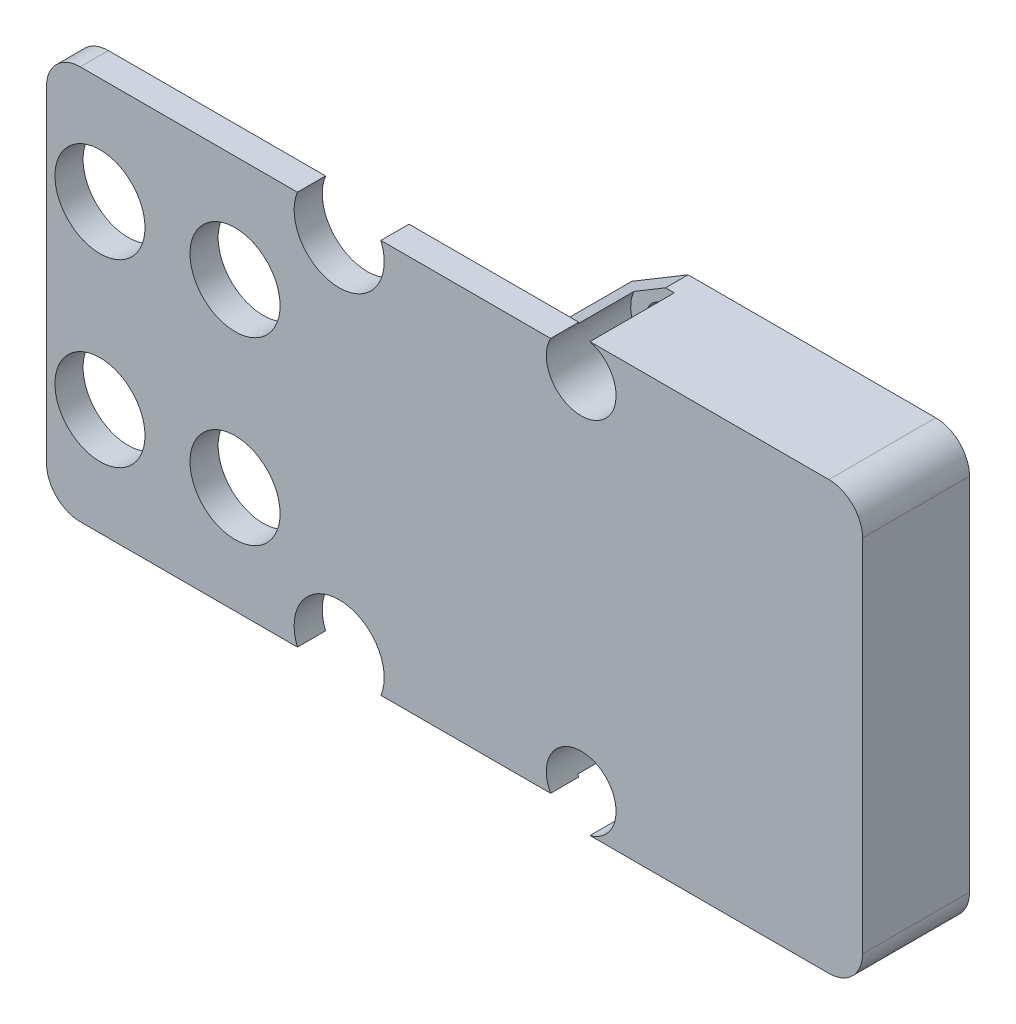
ISO-10303-21;
HEADER;
FILE_DESCRIPTION(('STEP AP214'),'2;1');
FILE_NAME('part.step','',(''),(''),'','','');
FILE_SCHEMA(('AUTOMOTIVE_DESIGN { 1 0 10303 214 1 1 1 1 }'));
ENDSEC;
DATA;
#1=APPLICATION_CONTEXT('core data for automotive mechanical design processes');
#2=APPLICATION_PROTOCOL_DEFINITION('international standard','automotive_design',2000,#1);
#3=PRODUCT_CONTEXT('',#1,'mechanical');
#4=PRODUCT('Part','Part','',(#3));
#5=PRODUCT_RELATED_PRODUCT_CATEGORY('part','',(#4));
#6=PRODUCT_DEFINITION_FORMATION('','',#4);
#7=PRODUCT_DEFINITION_CONTEXT('part definition',#1,'design');
#8=PRODUCT_DEFINITION('design','',#6,#7);
#9=PRODUCT_DEFINITION_SHAPE('','',#8);
#10=(LENGTH_UNIT() NAMED_UNIT(*) SI_UNIT(.MILLI.,.METRE.));
#11=(NAMED_UNIT(*) PLANE_ANGLE_UNIT() SI_UNIT($,.RADIAN.));
#12=(NAMED_UNIT(*) SI_UNIT($,.STERADIAN.) SOLID_ANGLE_UNIT());
#13=UNCERTAINTY_MEASURE_WITH_UNIT(LENGTH_MEASURE(1.E-05),#10,'distance_accuracy_value','');
#14=(GEOMETRIC_REPRESENTATION_CONTEXT(3) GLOBAL_UNCERTAINTY_ASSIGNED_CONTEXT((#13)) GLOBAL_UNIT_ASSIGNED_CONTEXT((#10,
#11,#12)) REPRESENTATION_CONTEXT('',''));
#15=CARTESIAN_POINT('',(0.,0.,0.));
#16=DIRECTION('',(0.,0.,1.));
#17=DIRECTION('',(1.,0.,0.));
#18=AXIS2_PLACEMENT_3D('',#15,#16,#17);
#19=CARTESIAN_POINT('',(-69.5864793964444,27.6995976152245,9.5));
#20=DIRECTION('',(0.,0.,-1.));
#21=DIRECTION('',(-1.,0.,0.));
#22=AXIS2_PLACEMENT_3D('',#19,#20,#21);
#23=CYLINDRICAL_SURFACE('',#22,1.70737013163461);
#24=CARTESIAN_POINT('',(-69.5864793964444,27.6995976152245,0.));
#25=DIRECTION('',(0.,0.,1.));
#26=DIRECTION('',(1.,0.,0.));
#27=AXIS2_PLACEMENT_3D('',#24,#25,#26);
#28=CIRCLE('',#27,1.70737013163461);
#29=CARTESIAN_POINT('',(-67.8791092648098,27.6995976152245,0.));
#30=VERTEX_POINT('',#29);
#31=EDGE_CURVE('E284',#30,#30,#28,.T.);
#32=ORIENTED_EDGE('',*,*,#31,.F.);
#33=EDGE_LOOP('',(#32));
#34=FACE_BOUND('',#33,.T.);
#35=CARTESIAN_POINT('',(-69.5864793964444,27.6995976152245,2.));
#36=DIRECTION('',(0.,0.,1.));
#37=DIRECTION('',(1.,0.,0.));
#38=AXIS2_PLACEMENT_3D('',#35,#36,#37);
#39=CIRCLE('',#38,1.70737013163461);
#40=CARTESIAN_POINT('',(-67.8791092648098,27.6995976152245,2.));
#41=VERTEX_POINT('',#40);
#42=EDGE_CURVE('E37',#41,#41,#39,.T.);
#43=ORIENTED_EDGE('',*,*,#42,.T.);
#44=EDGE_LOOP('',(#43));
#45=FACE_BOUND('',#44,.T.);
#46=ADVANCED_FACE('F33',(#34,#45),#23,.F.);
#47=CARTESIAN_POINT('',(-69.5864793964444,-4.30040238477549,9.5));
#48=DIRECTION('',(0.,0.,-1.));
#49=DIRECTION('',(-1.,0.,0.));
#50=AXIS2_PLACEMENT_3D('',#47,#48,#49);
#51=CYLINDRICAL_SURFACE('',#50,1.70737013163461);
#52=CARTESIAN_POINT('',(-69.5864793964444,-4.30040238477549,0.));
#53=DIRECTION('',(0.,0.,1.));
#54=DIRECTION('',(1.,0.,0.));
#55=AXIS2_PLACEMENT_3D('',#52,#53,#54);
#56=CIRCLE('',#55,1.70737013163461);
#57=CARTESIAN_POINT('',(-67.8791092648098,-4.30040238477549,0.));
#58=VERTEX_POINT('',#57);
#59=EDGE_CURVE('E274',#58,#58,#56,.T.);
#60=ORIENTED_EDGE('',*,*,#59,.F.);
#61=EDGE_LOOP('',(#60));
#62=FACE_BOUND('',#61,.T.);
#63=CARTESIAN_POINT('',(-69.5864793964444,-4.30040238477549,2.));
#64=DIRECTION('',(0.,0.,1.));
#65=DIRECTION('',(1.,0.,0.));
#66=AXIS2_PLACEMENT_3D('',#63,#64,#65);
#67=CIRCLE('',#66,1.70737013163461);
#68=CARTESIAN_POINT('',(-67.8791092648098,-4.30040238477549,2.));
#69=VERTEX_POINT('',#68);
#70=EDGE_CURVE('E208',#69,#69,#67,.T.);
#71=ORIENTED_EDGE('',*,*,#70,.T.);
#72=EDGE_LOOP('',(#71));
#73=FACE_BOUND('',#72,.T.);
#74=ADVANCED_FACE('F458',(#62,#73),#51,.F.);
#75=CARTESIAN_POINT('',(-117.086479396444,-5.80040238477549,7.));
#76=DIRECTION('',(0.,-1.,0.));
#77=DIRECTION('',(1.,0.,0.));
#78=AXIS2_PLACEMENT_3D('',#75,#76,#77);
#79=PLANE('',#78);
#80=DIRECTION('',(0.,0.,1.));
#81=VECTOR('',#80,1.);
#82=CARTESIAN_POINT('',(-72.2994113896945,-5.80040238477549,2.));
#83=LINE('',#82,#81);
#84=CARTESIAN_POINT('',(-72.2994113896945,-5.80040238477549,9.5));
#85=VERTEX_POINT('',#84);
#86=CARTESIAN_POINT('',(-72.2994113896945,-5.80040238477549,7.));
#87=VERTEX_POINT('',#86);
#88=EDGE_CURVE('E50',#85,#87,#83,.F.);
#89=ORIENTED_EDGE('',*,*,#88,.F.);
#90=DIRECTION('',(1.,0.,0.));
#91=VECTOR('',#90,1.);
#92=CARTESIAN_POINT('',(-117.086479396444,-5.80040238477549,9.5));
#93=LINE('',#92,#91);
#94=CARTESIAN_POINT('',(-87.3783801528965,-5.80040238477549,9.5));
#95=VERTEX_POINT('',#94);
#96=EDGE_CURVE('E280',#95,#85,#93,.T.);
#97=ORIENTED_EDGE('',*,*,#96,.F.);
#98=DIRECTION('',(0.,0.,1.));
#99=VECTOR('',#98,1.);
#100=CARTESIAN_POINT('',(-87.3783801528965,-5.80040238477549,7.));
#101=LINE('',#100,#99);
#102=CARTESIAN_POINT('',(-87.3783801528965,-5.80040238477549,7.));
#103=VERTEX_POINT('',#102);
#104=EDGE_CURVE('E248',#103,#95,#101,.T.);
#105=ORIENTED_EDGE('',*,*,#104,.F.);
#106=DIRECTION('',(1.,0.,0.));
#107=VECTOR('',#106,1.);
#108=CARTESIAN_POINT('',(-117.086479396444,-5.80040238477549,7.));
#109=LINE('',#108,#107);
#110=EDGE_CURVE('E266',#103,#87,#109,.T.);
#111=ORIENTED_EDGE('',*,*,#110,.T.);
#112=EDGE_LOOP('',(#89,#97,#105,#111));
#113=FACE_BOUND('',#112,.T.);
#114=ADVANCED_FACE('F404',(#113),#79,.T.);
#115=CARTESIAN_POINT('',(-72.0864793964444,29.1995976152245,7.));
#116=DIRECTION('',(0.,1.,0.));
#117=DIRECTION('',(-1.,0.,0.));
#118=AXIS2_PLACEMENT_3D('',#115,#116,#117);
#119=PLANE('',#118);
#120=DIRECTION('',(-1.,0.,0.));
#121=VECTOR('',#120,1.);
#122=CARTESIAN_POINT('',(-72.0864793964444,29.1995976152245,7.));
#123=LINE('',#122,#121);
#124=CARTESIAN_POINT('',(-94.7945786399922,29.1995976152245,7.));
#125=VERTEX_POINT('',#124);
#126=CARTESIAN_POINT('',(-114.086479396444,29.1995976152245,7.));
#127=VERTEX_POINT('',#126);
#128=EDGE_CURVE('E259',#125,#127,#123,.T.);
#129=ORIENTED_EDGE('',*,*,#128,.T.);
#130=DIRECTION('',(0.,0.,1.));
#131=VECTOR('',#130,1.);
#132=CARTESIAN_POINT('',(-114.086479396444,29.1995976152245,7.));
#133=LINE('',#132,#131);
#134=CARTESIAN_POINT('',(-114.086479396444,29.1995976152245,9.5));
#135=VERTEX_POINT('',#134);
#136=EDGE_CURVE('E325',#127,#135,#133,.T.);
#137=ORIENTED_EDGE('',*,*,#136,.T.);
#138=DIRECTION('',(-1.,0.,0.));
#139=VECTOR('',#138,1.);
#140=CARTESIAN_POINT('',(-72.0864793964444,29.1995976152245,9.5));
#141=LINE('',#140,#139);
#142=CARTESIAN_POINT('',(-94.7945786399922,29.1995976152245,9.5));
#143=VERTEX_POINT('',#142);
#144=EDGE_CURVE('E255',#143,#135,#141,.T.);
#145=ORIENTED_EDGE('',*,*,#144,.F.);
#146=DIRECTION('',(0.,0.,1.));
#147=VECTOR('',#146,1.);
#148=CARTESIAN_POINT('',(-94.7945786399922,29.1995976152245,7.));
#149=LINE('',#148,#147);
#150=EDGE_CURVE('E253',#125,#143,#149,.T.);
#151=ORIENTED_EDGE('',*,*,#150,.F.);
#152=EDGE_LOOP('',(#129,#137,#145,#151));
#153=FACE_BOUND('',#152,.T.);
#154=ADVANCED_FACE('F436',(#153),#119,.T.);
#155=CARTESIAN_POINT('',(-74.5864793964444,27.6995976152245,9.5));
#156=DIRECTION('',(1.,0.,0.));
#157=DIRECTION('',(0.,0.,-1.));
#158=AXIS2_PLACEMENT_3D('',#155,#156,#157);
#159=PLANE('',#158);
#160=DIRECTION('',(0.,1.,0.));
#161=VECTOR('',#160,1.);
#162=CARTESIAN_POINT('',(-74.5864793964444,-4.30040238477549,7.));
#163=LINE('',#162,#161);
#164=CARTESIAN_POINT('',(-74.5864793964444,-4.30040238477549,7.));
#165=VERTEX_POINT('',#164);
#166=CARTESIAN_POINT('',(-74.5864793964444,27.6995976152245,7.));
#167=VERTEX_POINT('',#166);
#168=EDGE_CURVE('E271',#165,#167,#163,.T.);
#169=ORIENTED_EDGE('',*,*,#168,.T.);
#170=DIRECTION('',(0.,0.,-1.));
#171=VECTOR('',#170,1.);
#172=CARTESIAN_POINT('',(-74.5864793964444,27.6995976152245,9.5));
#173=LINE('',#172,#171);
#174=CARTESIAN_POINT('',(-74.5864793964444,27.6995976152245,0.));
#175=VERTEX_POINT('',#174);
#176=EDGE_CURVE('E317',#167,#175,#173,.T.);
#177=ORIENTED_EDGE('',*,*,#176,.T.);
#178=DIRECTION('',(0.,-1.,0.));
#179=VECTOR('',#178,1.);
#180=CARTESIAN_POINT('',(-74.5864793964444,27.6995976152245,0.));
#181=LINE('',#180,#179);
#182=CARTESIAN_POINT('',(-74.5864793964444,-4.30040238477549,0.));
#183=VERTEX_POINT('',#182);
#184=EDGE_CURVE('E300',#175,#183,#181,.T.);
#185=ORIENTED_EDGE('',*,*,#184,.T.);
#186=DIRECTION('',(0.,0.,-1.));
#187=VECTOR('',#186,1.);
#188=CARTESIAN_POINT('',(-74.5864793964444,-4.30040238477549,9.5));
#189=LINE('',#188,#187);
#190=EDGE_CURVE('E315',#165,#183,#189,.T.);
#191=ORIENTED_EDGE('',*,*,#190,.F.);
#192=EDGE_LOOP('',(#169,#177,#185,#191));
#193=FACE_BOUND('',#192,.T.);
#194=ADVANCED_FACE('F396',(#193),#159,.F.);
#195=CARTESIAN_POINT('',(0.,0.,9.5));
#196=DIRECTION('',(0.,0.,-1.));
#197=DIRECTION('',(-1.,0.,0.));
#198=AXIS2_PLACEMENT_3D('',#195,#196,#197);
#199=PLANE('',#198);
#200=CARTESIAN_POINT('',(-100.336479396444,19.6995976152245,9.5));
#201=DIRECTION('',(0.,0.,1.));
#202=DIRECTION('',(1.,0.,0.));
#203=AXIS2_PLACEMENT_3D('',#200,#201,#202);
#204=CIRCLE('',#203,4.00000000000001);
#205=CARTESIAN_POINT('',(-96.3364793964443,19.6995976152245,9.5));
#206=VERTEX_POINT('',#205);
#207=EDGE_CURVE('E219',#206,#206,#204,.T.);
#208=ORIENTED_EDGE('',*,*,#207,.F.);
#209=EDGE_LOOP('',(#208));
#210=FACE_BOUND('',#209,.T.);
#211=CARTESIAN_POINT('',(-112.336479396444,19.6995976152245,9.5));
#212=DIRECTION('',(0.,0.,1.));
#213=DIRECTION('',(1.,0.,0.));
#214=AXIS2_PLACEMENT_3D('',#211,#212,#213);
#215=CIRCLE('',#214,4.00000000000001);
#216=CARTESIAN_POINT('',(-108.336479396444,19.6995976152245,9.5));
#217=VERTEX_POINT('',#216);
#218=EDGE_CURVE('E220',#217,#217,#215,.T.);
#219=ORIENTED_EDGE('',*,*,#218,.F.);
#220=EDGE_LOOP('',(#219));
#221=FACE_BOUND('',#220,.T.);
#222=CARTESIAN_POINT('',(-112.336479396444,3.69959761522452,9.5));
#223=DIRECTION('',(0.,0.,1.));
#224=DIRECTION('',(1.,0.,0.));
#225=AXIS2_PLACEMENT_3D('',#222,#223,#224);
#226=CIRCLE('',#225,4.00000000000001);
#227=CARTESIAN_POINT('',(-108.336479396444,3.69959761522452,9.5));
#228=VERTEX_POINT('',#227);
#229=EDGE_CURVE('E226',#228,#228,#226,.T.);
#230=ORIENTED_EDGE('',*,*,#229,.F.);
#231=EDGE_LOOP('',(#230));
#232=FACE_BOUND('',#231,.T.);
#233=CARTESIAN_POINT('',(-100.336479396444,3.69959761522452,9.5));
#234=DIRECTION('',(0.,0.,1.));
#235=DIRECTION('',(1.,0.,0.));
#236=AXIS2_PLACEMENT_3D('',#233,#234,#235);
#237=CIRCLE('',#236,4.00000000000001);
#238=CARTESIAN_POINT('',(-96.3364793964443,3.69959761522452,9.5));
#239=VERTEX_POINT('',#238);
#240=EDGE_CURVE('E215',#239,#239,#237,.T.);
#241=ORIENTED_EDGE('',*,*,#240,.F.);
#242=EDGE_LOOP('',(#241));
#243=FACE_BOUND('',#242,.T.);
#244=DIRECTION('',(-1.,0.,0.));
#245=VECTOR('',#244,1.);
#246=CARTESIAN_POINT('',(-69.5864793964444,30.6995976152245,9.5));
#247=LINE('',#246,#245);
#248=CARTESIAN_POINT('',(-47.5864793964444,30.6995976152245,9.5));
#249=VERTEX_POINT('',#248);
#250=CARTESIAN_POINT('',(-68.8054544288537,30.6995976152245,9.5));
#251=VERTEX_POINT('',#250);
#252=EDGE_CURVE('E294',#249,#251,#247,.T.);
#253=ORIENTED_EDGE('',*,*,#252,.T.);
#254=CARTESIAN_POINT('',(-69.5864793964444,27.6995976152245,9.5));
#255=DIRECTION('',(0.,0.,1.));
#256=DIRECTION('',(1.,0.,0.));
#257=AXIS2_PLACEMENT_3D('',#254,#255,#256);
#258=CIRCLE('',#257,3.1);
#259=CARTESIAN_POINT('',(-72.2994113896945,29.1995976152245,9.5));
#260=VERTEX_POINT('',#259);
#261=EDGE_CURVE('E198',#260,#251,#258,.T.);
#262=ORIENTED_EDGE('',*,*,#261,.F.);
#263=CARTESIAN_POINT('',(-87.3783801528965,29.1995976152245,9.5));
#264=VERTEX_POINT('',#263);
#265=EDGE_CURVE('E275',#260,#264,#141,.T.);
#266=ORIENTED_EDGE('',*,*,#265,.T.);
#267=CARTESIAN_POINT('',(-91.0864793964443,27.6995976152245,9.5));
#268=DIRECTION('',(0.,0.,1.));
#269=DIRECTION('',(1.,0.,0.));
#270=AXIS2_PLACEMENT_3D('',#267,#268,#269);
#271=CIRCLE('',#270,4.00000000000001);
#272=EDGE_CURVE('E237',#143,#264,#271,.T.);
#273=ORIENTED_EDGE('',*,*,#272,.F.);
#274=ORIENTED_EDGE('',*,*,#144,.T.);
#275=CARTESIAN_POINT('',(-114.086479396444,26.1995976152245,9.5));
#276=DIRECTION('',(0.,0.,-1.));
#277=DIRECTION('',(-1.,0.,0.));
#278=AXIS2_PLACEMENT_3D('',#275,#276,#277);
#279=CIRCLE('',#278,3.);
#280=CARTESIAN_POINT('',(-117.086479396444,26.1995976152245,9.5));
#281=VERTEX_POINT('',#280);
#282=EDGE_CURVE('E334',#135,#281,#279,.F.);
#283=ORIENTED_EDGE('',*,*,#282,.T.);
#284=DIRECTION('',(0.,-1.,0.));
#285=VECTOR('',#284,1.);
#286=CARTESIAN_POINT('',(-117.086479396444,29.1995976152245,9.5));
#287=LINE('',#286,#285);
#288=CARTESIAN_POINT('',(-117.086479396444,-2.8004023847755,9.5));
#289=VERTEX_POINT('',#288);
#290=EDGE_CURVE('E277',#281,#289,#287,.T.);
#291=ORIENTED_EDGE('',*,*,#290,.T.);
#292=CARTESIAN_POINT('',(-114.086479396444,-2.8004023847755,9.5));
#293=DIRECTION('',(0.,0.,-1.));
#294=DIRECTION('',(-1.,0.,0.));
#295=AXIS2_PLACEMENT_3D('',#292,#293,#294);
#296=CIRCLE('',#295,3.);
#297=CARTESIAN_POINT('',(-114.086479396444,-5.80040238477549,9.5));
#298=VERTEX_POINT('',#297);
#299=EDGE_CURVE('E332',#289,#298,#296,.F.);
#300=ORIENTED_EDGE('',*,*,#299,.T.);
#301=CARTESIAN_POINT('',(-94.7945786399922,-5.80040238477549,9.5));
#302=VERTEX_POINT('',#301);
#303=EDGE_CURVE('E260',#298,#302,#93,.T.);
#304=ORIENTED_EDGE('',*,*,#303,.T.);
#305=CARTESIAN_POINT('',(-91.0864793964443,-4.3004023847755,9.5));
#306=DIRECTION('',(0.,0.,1.));
#307=DIRECTION('',(1.,0.,0.));
#308=AXIS2_PLACEMENT_3D('',#305,#306,#307);
#309=CIRCLE('',#308,4.00000000000001);
#310=EDGE_CURVE('E242',#95,#302,#309,.T.);
#311=ORIENTED_EDGE('',*,*,#310,.F.);
#312=ORIENTED_EDGE('',*,*,#96,.T.);
#313=CARTESIAN_POINT('',(-69.5864793964444,-4.30040238477549,9.5));
#314=DIRECTION('',(0.,0.,1.));
#315=DIRECTION('',(1.,0.,0.));
#316=AXIS2_PLACEMENT_3D('',#313,#314,#315);
#317=CIRCLE('',#316,3.1);
#318=CARTESIAN_POINT('',(-68.8054544288537,-7.30040238477549,9.5));
#319=VERTEX_POINT('',#318);
#320=EDGE_CURVE('E199',#319,#85,#317,.T.);
#321=ORIENTED_EDGE('',*,*,#320,.F.);
#322=DIRECTION('',(1.,0.,0.));
#323=VECTOR('',#322,1.);
#324=CARTESIAN_POINT('',(-69.5864793964444,-7.30040238477549,9.5));
#325=LINE('',#324,#323);
#326=CARTESIAN_POINT('',(-47.5864793964444,-7.30040238477549,9.5));
#327=VERTEX_POINT('',#326);
#328=EDGE_CURVE('E288',#319,#327,#325,.T.);
#329=ORIENTED_EDGE('',*,*,#328,.T.);
#330=CARTESIAN_POINT('',(-47.5864793964444,-4.30040238477549,9.5));
#331=DIRECTION('',(0.,0.,-1.));
#332=DIRECTION('',(-1.,0.,0.));
#333=AXIS2_PLACEMENT_3D('',#330,#331,#332);
#334=CIRCLE('',#333,3.);
#335=CARTESIAN_POINT('',(-44.5864793964444,-4.30040238477549,9.5));
#336=VERTEX_POINT('',#335);
#337=EDGE_CURVE('E328',#327,#336,#334,.F.);
#338=ORIENTED_EDGE('',*,*,#337,.T.);
#339=DIRECTION('',(0.,1.,0.));
#340=VECTOR('',#339,1.);
#341=CARTESIAN_POINT('',(-44.5864793964444,30.6995976152245,9.5));
#342=LINE('',#341,#340);
#343=CARTESIAN_POINT('',(-44.5864793964444,27.6995976152245,9.5));
#344=VERTEX_POINT('',#343);
#345=EDGE_CURVE('E290',#336,#344,#342,.T.);
#346=ORIENTED_EDGE('',*,*,#345,.T.);
#347=CARTESIAN_POINT('',(-47.5864793964444,27.6995976152245,9.5));
#348=DIRECTION('',(0.,0.,-1.));
#349=DIRECTION('',(-1.,0.,0.));
#350=AXIS2_PLACEMENT_3D('',#347,#348,#349);
#351=CIRCLE('',#350,3.);
#352=EDGE_CURVE('E330',#344,#249,#351,.F.);
#353=ORIENTED_EDGE('',*,*,#352,.T.);
#354=EDGE_LOOP('',(#253,#262,#266,#273,#274,#283,#291,#300,#304,#311,#312,#321,#329,#338,#346,#353));
#355=FACE_BOUND('',#354,.T.);
#356=ADVANCED_FACE('F412',(#210,#221,#232,#243,#355),#199,.F.);
#357=CARTESIAN_POINT('',(0.,0.,0.));
#358=DIRECTION('',(0.,0.,-1.));
#359=DIRECTION('',(-1.,0.,0.));
#360=AXIS2_PLACEMENT_3D('',#357,#358,#359);
#361=PLANE('',#360);
#362=ORIENTED_EDGE('',*,*,#31,.T.);
#363=EDGE_LOOP('',(#362));
#364=FACE_BOUND('',#363,.T.);
#365=DIRECTION('',(-1.,0.,0.));
#366=VECTOR('',#365,1.);
#367=CARTESIAN_POINT('',(-69.5864793964444,30.6995976152245,0.));
#368=LINE('',#367,#366);
#369=CARTESIAN_POINT('',(-47.5864793964444,30.6995976152245,0.));
#370=VERTEX_POINT('',#369);
#371=CARTESIAN_POINT('',(-69.5864793964444,30.6995976152245,0.));
#372=VERTEX_POINT('',#371);
#373=EDGE_CURVE('E291',#370,#372,#368,.T.);
#374=ORIENTED_EDGE('',*,*,#373,.F.);
#375=CARTESIAN_POINT('',(-47.5864793964444,27.6995976152245,0.));
#376=DIRECTION('',(0.,0.,-1.));
#377=DIRECTION('',(-1.,0.,0.));
#378=AXIS2_PLACEMENT_3D('',#375,#376,#377);
#379=CIRCLE('',#378,3.);
#380=CARTESIAN_POINT('',(-44.5864793964444,27.6995976152245,0.));
#381=VERTEX_POINT('',#380);
#382=EDGE_CURVE('E352',#370,#381,#379,.T.);
#383=ORIENTED_EDGE('',*,*,#382,.T.);
#384=DIRECTION('',(0.,1.,0.));
#385=VECTOR('',#384,1.);
#386=CARTESIAN_POINT('',(-44.5864793964444,30.6995976152245,0.));
#387=LINE('',#386,#385);
#388=CARTESIAN_POINT('',(-44.5864793964444,-4.30040238477549,0.));
#389=VERTEX_POINT('',#388);
#390=EDGE_CURVE('E308',#389,#381,#387,.T.);
#391=ORIENTED_EDGE('',*,*,#390,.F.);
#392=CARTESIAN_POINT('',(-47.5864793964444,-4.30040238477549,0.));
#393=DIRECTION('',(0.,0.,-1.));
#394=DIRECTION('',(-1.,0.,0.));
#395=AXIS2_PLACEMENT_3D('',#392,#393,#394);
#396=CIRCLE('',#395,3.);
#397=CARTESIAN_POINT('',(-47.5864793964444,-7.30040238477549,0.));
#398=VERTEX_POINT('',#397);
#399=EDGE_CURVE('E350',#389,#398,#396,.T.);
#400=ORIENTED_EDGE('',*,*,#399,.T.);
#401=DIRECTION('',(1.,0.,0.));
#402=VECTOR('',#401,1.);
#403=CARTESIAN_POINT('',(-69.5864793964444,-7.30040238477549,0.));
#404=LINE('',#403,#402);
#405=CARTESIAN_POINT('',(-69.5864793964444,-7.30040238477549,0.));
#406=VERTEX_POINT('',#405);
#407=EDGE_CURVE('E305',#406,#398,#404,.T.);
#408=ORIENTED_EDGE('',*,*,#407,.F.);
#409=DIRECTION('',(0.857492925712544,-0.514495755427526,0.));
#410=VECTOR('',#409,1.);
#411=CARTESIAN_POINT('',(-74.5864793964444,-4.30040238477549,0.));
#412=LINE('',#411,#410);
#413=EDGE_CURVE('E303',#183,#406,#412,.T.);
#414=ORIENTED_EDGE('',*,*,#413,.F.);
#415=ORIENTED_EDGE('',*,*,#184,.F.);
#416=DIRECTION('',(-0.857492925712544,-0.514495755427527,0.));
#417=VECTOR('',#416,1.);
#418=CARTESIAN_POINT('',(-74.5864793964444,27.6995976152245,0.));
#419=LINE('',#418,#417);
#420=EDGE_CURVE('E287',#372,#175,#419,.T.);
#421=ORIENTED_EDGE('',*,*,#420,.F.);
#422=EDGE_LOOP('',(#374,#383,#391,#400,#408,#414,#415,#421));
#423=FACE_BOUND('',#422,.T.);
#424=ORIENTED_EDGE('',*,*,#59,.T.);
#425=EDGE_LOOP('',(#424));
#426=FACE_BOUND('',#425,.T.);
#427=ADVANCED_FACE('F472',(#364,#423,#426),#361,.T.);
#428=CARTESIAN_POINT('',(-74.5864793964444,27.6995976152245,9.5));
#429=DIRECTION('',(0.514495755427527,-0.857492925712544,0.));
#430=DIRECTION('',(0.857492925712544,0.514495755427527,0.));
#431=AXIS2_PLACEMENT_3D('',#428,#429,#430);
#432=PLANE('',#431);
#433=DIRECTION('',(0.857492925712544,0.514495755427527,0.));
#434=VECTOR('',#433,1.);
#435=CARTESIAN_POINT('',(-74.5864793964444,27.6995976152245,7.));
#436=LINE('',#435,#434);
#437=CARTESIAN_POINT('',(-72.3933359857296,29.0154836616534,7.));
#438=VERTEX_POINT('',#437);
#439=EDGE_CURVE('E256',#167,#438,#436,.T.);
#440=ORIENTED_EDGE('',*,*,#439,.T.);
#441=DIRECTION('',(0.,0.,1.));
#442=VECTOR('',#441,1.);
#443=CARTESIAN_POINT('',(-72.3933359857296,29.0154836616534,2.));
#444=LINE('',#443,#442);
#445=CARTESIAN_POINT('',(-72.3933359857296,29.0154836616534,2.));
#446=VERTEX_POINT('',#445);
#447=EDGE_CURVE('E58',#438,#446,#444,.F.);
#448=ORIENTED_EDGE('',*,*,#447,.T.);
#449=DIRECTION('',(-0.857492925712544,-0.514495755427527,0.));
#450=VECTOR('',#449,1.);
#451=CARTESIAN_POINT('',(-74.5864793964444,27.6995976152245,2.));
#452=LINE('',#451,#450);
#453=CARTESIAN_POINT('',(-69.5864793964444,30.6995976152245,2.));
#454=VERTEX_POINT('',#453);
#455=EDGE_CURVE('E213',#454,#446,#452,.T.);
#456=ORIENTED_EDGE('',*,*,#455,.F.);
#457=DIRECTION('',(0.,0.,-1.));
#458=VECTOR('',#457,1.);
#459=CARTESIAN_POINT('',(-69.5864793964444,30.6995976152245,9.5));
#460=LINE('',#459,#458);
#461=EDGE_CURVE('E297',#454,#372,#460,.T.);
#462=ORIENTED_EDGE('',*,*,#461,.T.);
#463=ORIENTED_EDGE('',*,*,#420,.T.);
#464=ORIENTED_EDGE('',*,*,#176,.F.);
#465=EDGE_LOOP('',(#440,#448,#456,#462,#463,#464));
#466=FACE_BOUND('',#465,.T.);
#467=ADVANCED_FACE('F388',(#466),#432,.F.);
#468=CARTESIAN_POINT('',(-74.5864793964444,-4.30040238477549,9.5));
#469=DIRECTION('',(0.514495755427526,0.857492925712544,0.));
#470=DIRECTION('',(-0.857492925712544,0.514495755427526,0.));
#471=AXIS2_PLACEMENT_3D('',#468,#469,#470);
#472=PLANE('',#471);
#473=DIRECTION('',(0.857492925712544,-0.514495755427526,0.));
#474=VECTOR('',#473,1.);
#475=CARTESIAN_POINT('',(-74.5864793964444,-4.30040238477549,2.));
#476=LINE('',#475,#474);
#477=CARTESIAN_POINT('',(-72.3933359857296,-5.61628843120437,2.));
#478=VERTEX_POINT('',#477);
#479=CARTESIAN_POINT('',(-69.5864793964444,-7.30040238477549,2.));
#480=VERTEX_POINT('',#479);
#481=EDGE_CURVE('E195',#478,#480,#476,.T.);
#482=ORIENTED_EDGE('',*,*,#481,.F.);
#483=DIRECTION('',(0.,0.,1.));
#484=VECTOR('',#483,1.);
#485=CARTESIAN_POINT('',(-72.3933359857296,-5.61628843120437,2.));
#486=LINE('',#485,#484);
#487=CARTESIAN_POINT('',(-72.3933359857296,-5.61628843120437,7.));
#488=VERTEX_POINT('',#487);
#489=EDGE_CURVE('E183',#478,#488,#486,.T.);
#490=ORIENTED_EDGE('',*,*,#489,.T.);
#491=DIRECTION('',(-0.857492925712544,0.514495755427526,0.));
#492=VECTOR('',#491,1.);
#493=CARTESIAN_POINT('',(-72.0864793964444,-5.80040238477549,7.));
#494=LINE('',#493,#492);
#495=EDGE_CURVE('E269',#488,#165,#494,.T.);
#496=ORIENTED_EDGE('',*,*,#495,.T.);
#497=ORIENTED_EDGE('',*,*,#190,.T.);
#498=ORIENTED_EDGE('',*,*,#413,.T.);
#499=DIRECTION('',(0.,0.,-1.));
#500=VECTOR('',#499,1.);
#501=CARTESIAN_POINT('',(-69.5864793964444,-7.30040238477549,9.5));
#502=LINE('',#501,#500);
#503=EDGE_CURVE('E204',#480,#406,#502,.T.);
#504=ORIENTED_EDGE('',*,*,#503,.F.);
#505=EDGE_LOOP('',(#482,#490,#496,#497,#498,#504));
#506=FACE_BOUND('',#505,.T.);
#507=ADVANCED_FACE('F202',(#506),#472,.F.);
#508=CARTESIAN_POINT('',(-69.5864793964444,-7.30040238477549,9.5));
#509=DIRECTION('',(0.,1.,0.));
#510=DIRECTION('',(0.,0.,1.));
#511=AXIS2_PLACEMENT_3D('',#508,#509,#510);
#512=PLANE('',#511);
#513=ORIENTED_EDGE('',*,*,#328,.F.);
#514=DIRECTION('',(0.,0.,1.));
#515=VECTOR('',#514,1.);
#516=CARTESIAN_POINT('',(-68.8054544288537,-7.30040238477549,2.));
#517=LINE('',#516,#515);
#518=CARTESIAN_POINT('',(-68.8054544288537,-7.30040238477549,2.));
#519=VERTEX_POINT('',#518);
#520=EDGE_CURVE('E374',#319,#519,#517,.F.);
#521=ORIENTED_EDGE('',*,*,#520,.T.);
#522=DIRECTION('',(1.,0.,0.));
#523=VECTOR('',#522,1.);
#524=CARTESIAN_POINT('',(-69.5864793964444,-7.30040238477549,2.));
#525=LINE('',#524,#523);
#526=EDGE_CURVE('E197',#480,#519,#525,.T.);
#527=ORIENTED_EDGE('',*,*,#526,.F.);
#528=ORIENTED_EDGE('',*,*,#503,.T.);
#529=ORIENTED_EDGE('',*,*,#407,.T.);
#530=DIRECTION('',(0.,0.,-1.));
#531=VECTOR('',#530,1.);
#532=CARTESIAN_POINT('',(-47.5864793964444,-7.30040238477549,9.5));
#533=LINE('',#532,#531);
#534=EDGE_CURVE('E359',#398,#327,#533,.F.);
#535=ORIENTED_EDGE('',*,*,#534,.T.);
#536=EDGE_LOOP('',(#513,#521,#527,#528,#529,#535));
#537=FACE_BOUND('',#536,.T.);
#538=ADVANCED_FACE('F482',(#537),#512,.F.);
#539=CARTESIAN_POINT('',(-44.5864793964444,30.6995976152245,9.5));
#540=DIRECTION('',(-1.,0.,0.));
#541=DIRECTION('',(0.,0.,1.));
#542=AXIS2_PLACEMENT_3D('',#539,#540,#541);
#543=PLANE('',#542);
#544=ORIENTED_EDGE('',*,*,#390,.T.);
#545=DIRECTION('',(0.,0.,-1.));
#546=VECTOR('',#545,1.);
#547=CARTESIAN_POINT('',(-44.5864793964444,27.6995976152245,9.5));
#548=LINE('',#547,#546);
#549=EDGE_CURVE('E357',#381,#344,#548,.F.);
#550=ORIENTED_EDGE('',*,*,#549,.T.);
#551=ORIENTED_EDGE('',*,*,#345,.F.);
#552=DIRECTION('',(0.,0.,-1.));
#553=VECTOR('',#552,1.);
#554=CARTESIAN_POINT('',(-44.5864793964444,-4.30040238477549,9.5));
#555=LINE('',#554,#553);
#556=EDGE_CURVE('E354',#336,#389,#555,.T.);
#557=ORIENTED_EDGE('',*,*,#556,.T.);
#558=EDGE_LOOP('',(#544,#550,#551,#557));
#559=FACE_BOUND('',#558,.T.);
#560=ADVANCED_FACE('F479',(#559),#543,.F.);
#561=CARTESIAN_POINT('',(-69.5864793964444,30.6995976152245,9.5));
#562=DIRECTION('',(0.,-1.,0.));
#563=DIRECTION('',(0.,0.,-1.));
#564=AXIS2_PLACEMENT_3D('',#561,#562,#563);
#565=PLANE('',#564);
#566=DIRECTION('',(-1.,0.,0.));
#567=VECTOR('',#566,1.);
#568=CARTESIAN_POINT('',(-69.5864793964444,30.6995976152245,2.));
#569=LINE('',#568,#567);
#570=CARTESIAN_POINT('',(-68.8054544288537,30.6995976152245,2.));
#571=VERTEX_POINT('',#570);
#572=EDGE_CURVE('E207',#571,#454,#569,.T.);
#573=ORIENTED_EDGE('',*,*,#572,.F.);
#574=DIRECTION('',(0.,0.,1.));
#575=VECTOR('',#574,1.);
#576=CARTESIAN_POINT('',(-68.8054544288537,30.6995976152245,2.));
#577=LINE('',#576,#575);
#578=EDGE_CURVE('E363',#571,#251,#577,.T.);
#579=ORIENTED_EDGE('',*,*,#578,.T.);
#580=ORIENTED_EDGE('',*,*,#252,.F.);
#581=DIRECTION('',(0.,0.,-1.));
#582=VECTOR('',#581,1.);
#583=CARTESIAN_POINT('',(-47.5864793964444,30.6995976152245,9.5));
#584=LINE('',#583,#582);
#585=EDGE_CURVE('E347',#249,#370,#584,.T.);
#586=ORIENTED_EDGE('',*,*,#585,.T.);
#587=ORIENTED_EDGE('',*,*,#373,.T.);
#588=ORIENTED_EDGE('',*,*,#461,.F.);
#589=EDGE_LOOP('',(#573,#579,#580,#586,#587,#588));
#590=FACE_BOUND('',#589,.T.);
#591=ADVANCED_FACE('F384',(#590),#565,.F.);
#592=ORIENTED_EDGE('',*,*,#303,.F.);
#593=DIRECTION('',(0.,0.,1.));
#594=VECTOR('',#593,1.);
#595=CARTESIAN_POINT('',(-114.086479396444,-5.80040238477549,7.));
#596=LINE('',#595,#594);
#597=CARTESIAN_POINT('',(-114.086479396444,-5.80040238477549,7.));
#598=VERTEX_POINT('',#597);
#599=EDGE_CURVE('E345',#298,#598,#596,.F.);
#600=ORIENTED_EDGE('',*,*,#599,.T.);
#601=CARTESIAN_POINT('',(-94.7945786399922,-5.80040238477549,7.));
#602=VERTEX_POINT('',#601);
#603=EDGE_CURVE('E267',#598,#602,#109,.T.);
#604=ORIENTED_EDGE('',*,*,#603,.T.);
#605=DIRECTION('',(0.,0.,1.));
#606=VECTOR('',#605,1.);
#607=CARTESIAN_POINT('',(-94.7945786399922,-5.80040238477549,7.));
#608=LINE('',#607,#606);
#609=EDGE_CURVE('E245',#302,#602,#608,.F.);
#610=ORIENTED_EDGE('',*,*,#609,.F.);
#611=EDGE_LOOP('',(#592,#600,#604,#610));
#612=FACE_BOUND('',#611,.T.);
#613=ADVANCED_FACE('F417',(#612),#79,.T.);
#614=CARTESIAN_POINT('',(-117.086479396444,29.1995976152245,7.));
#615=DIRECTION('',(-1.,0.,0.));
#616=DIRECTION('',(0.,-1.,0.));
#617=AXIS2_PLACEMENT_3D('',#614,#615,#616);
#618=PLANE('',#617);
#619=ORIENTED_EDGE('',*,*,#290,.F.);
#620=DIRECTION('',(0.,0.,1.));
#621=VECTOR('',#620,1.);
#622=CARTESIAN_POINT('',(-117.086479396444,26.1995976152245,7.));
#623=LINE('',#622,#621);
#624=CARTESIAN_POINT('',(-117.086479396444,26.1995976152245,7.));
#625=VERTEX_POINT('',#624);
#626=EDGE_CURVE('E339',#281,#625,#623,.F.);
#627=ORIENTED_EDGE('',*,*,#626,.T.);
#628=DIRECTION('',(0.,-1.,0.));
#629=VECTOR('',#628,1.);
#630=CARTESIAN_POINT('',(-117.086479396444,29.1995976152245,7.));
#631=LINE('',#630,#629);
#632=CARTESIAN_POINT('',(-117.086479396444,-2.8004023847755,7.));
#633=VERTEX_POINT('',#632);
#634=EDGE_CURVE('E263',#625,#633,#631,.T.);
#635=ORIENTED_EDGE('',*,*,#634,.T.);
#636=DIRECTION('',(0.,0.,1.));
#637=VECTOR('',#636,1.);
#638=CARTESIAN_POINT('',(-117.086479396444,-2.8004023847755,7.));
#639=LINE('',#638,#637);
#640=EDGE_CURVE('E336',#633,#289,#639,.T.);
#641=ORIENTED_EDGE('',*,*,#640,.T.);
#642=EDGE_LOOP('',(#619,#627,#635,#641));
#643=FACE_BOUND('',#642,.T.);
#644=ADVANCED_FACE('F427',(#643),#618,.T.);
#645=DIRECTION('',(0.,0.,1.));
#646=VECTOR('',#645,1.);
#647=CARTESIAN_POINT('',(-72.2994113896945,29.1995976152245,2.));
#648=LINE('',#647,#646);
#649=CARTESIAN_POINT('',(-72.2994113896945,29.1995976152245,7.));
#650=VERTEX_POINT('',#649);
#651=EDGE_CURVE('E370',#650,#260,#648,.T.);
#652=ORIENTED_EDGE('',*,*,#651,.F.);
#653=CARTESIAN_POINT('',(-87.3783801528965,29.1995976152245,7.));
#654=VERTEX_POINT('',#653);
#655=EDGE_CURVE('E261',#650,#654,#123,.T.);
#656=ORIENTED_EDGE('',*,*,#655,.T.);
#657=DIRECTION('',(0.,0.,1.));
#658=VECTOR('',#657,1.);
#659=CARTESIAN_POINT('',(-87.3783801528965,29.1995976152245,7.));
#660=LINE('',#659,#658);
#661=EDGE_CURVE('E250',#264,#654,#660,.F.);
#662=ORIENTED_EDGE('',*,*,#661,.F.);
#663=ORIENTED_EDGE('',*,*,#265,.F.);
#664=EDGE_LOOP('',(#652,#656,#662,#663));
#665=FACE_BOUND('',#664,.T.);
#666=ADVANCED_FACE('F447',(#665),#119,.T.);
#667=CARTESIAN_POINT('',(0.,0.,7.));
#668=DIRECTION('',(0.,0.,1.));
#669=DIRECTION('',(1.,0.,0.));
#670=AXIS2_PLACEMENT_3D('',#667,#668,#669);
#671=PLANE('',#670);
#672=CARTESIAN_POINT('',(-100.336479396444,19.6995976152245,7.));
#673=DIRECTION('',(0.,0.,1.));
#674=DIRECTION('',(1.,0.,0.));
#675=AXIS2_PLACEMENT_3D('',#672,#673,#674);
#676=CIRCLE('',#675,4.00000000000001);
#677=CARTESIAN_POINT('',(-96.3364793964443,19.6995976152245,7.));
#678=VERTEX_POINT('',#677);
#679=EDGE_CURVE('E234',#678,#678,#676,.T.);
#680=ORIENTED_EDGE('',*,*,#679,.T.);
#681=EDGE_LOOP('',(#680));
#682=FACE_BOUND('',#681,.T.);
#683=CARTESIAN_POINT('',(-112.336479396444,19.6995976152245,7.));
#684=DIRECTION('',(0.,0.,1.));
#685=DIRECTION('',(1.,0.,0.));
#686=AXIS2_PLACEMENT_3D('',#683,#684,#685);
#687=CIRCLE('',#686,4.00000000000001);
#688=CARTESIAN_POINT('',(-108.336479396444,19.6995976152245,7.));
#689=VERTEX_POINT('',#688);
#690=EDGE_CURVE('E216',#689,#689,#687,.T.);
#691=ORIENTED_EDGE('',*,*,#690,.T.);
#692=EDGE_LOOP('',(#691));
#693=FACE_BOUND('',#692,.T.);
#694=CARTESIAN_POINT('',(-112.336479396444,3.69959761522452,7.));
#695=DIRECTION('',(0.,0.,1.));
#696=DIRECTION('',(1.,0.,0.));
#697=AXIS2_PLACEMENT_3D('',#694,#695,#696);
#698=CIRCLE('',#697,4.00000000000001);
#699=CARTESIAN_POINT('',(-108.336479396444,3.69959761522452,7.));
#700=VERTEX_POINT('',#699);
#701=EDGE_CURVE('E223',#700,#700,#698,.T.);
#702=ORIENTED_EDGE('',*,*,#701,.T.);
#703=EDGE_LOOP('',(#702));
#704=FACE_BOUND('',#703,.T.);
#705=CARTESIAN_POINT('',(-100.336479396444,3.69959761522452,7.));
#706=DIRECTION('',(0.,0.,1.));
#707=DIRECTION('',(1.,0.,0.));
#708=AXIS2_PLACEMENT_3D('',#705,#706,#707);
#709=CIRCLE('',#708,4.00000000000001);
#710=CARTESIAN_POINT('',(-96.3364793964443,3.69959761522452,7.));
#711=VERTEX_POINT('',#710);
#712=EDGE_CURVE('E229',#711,#711,#709,.T.);
#713=ORIENTED_EDGE('',*,*,#712,.T.);
#714=EDGE_LOOP('',(#713));
#715=FACE_BOUND('',#714,.T.);
#716=ORIENTED_EDGE('',*,*,#655,.F.);
#717=CARTESIAN_POINT('',(-69.5864793964444,27.6995976152245,7.));
#718=DIRECTION('',(0.,0.,1.));
#719=DIRECTION('',(1.,0.,0.));
#720=AXIS2_PLACEMENT_3D('',#717,#718,#719);
#721=CIRCLE('',#720,3.1);
#722=EDGE_CURVE('E11',#650,#438,#721,.T.);
#723=ORIENTED_EDGE('',*,*,#722,.T.);
#724=ORIENTED_EDGE('',*,*,#439,.F.);
#725=ORIENTED_EDGE('',*,*,#168,.F.);
#726=ORIENTED_EDGE('',*,*,#495,.F.);
#727=CARTESIAN_POINT('',(-69.5864793964444,-4.30040238477549,7.));
#728=DIRECTION('',(0.,0.,1.));
#729=DIRECTION('',(1.,0.,0.));
#730=AXIS2_PLACEMENT_3D('',#727,#728,#729);
#731=CIRCLE('',#730,3.1);
#732=EDGE_CURVE('E42',#488,#87,#731,.T.);
#733=ORIENTED_EDGE('',*,*,#732,.T.);
#734=ORIENTED_EDGE('',*,*,#110,.F.);
#735=CARTESIAN_POINT('',(-91.0864793964443,-4.3004023847755,7.));
#736=DIRECTION('',(0.,0.,1.));
#737=DIRECTION('',(1.,0.,0.));
#738=AXIS2_PLACEMENT_3D('',#735,#736,#737);
#739=CIRCLE('',#738,4.00000000000001);
#740=EDGE_CURVE('E319',#103,#602,#739,.T.);
#741=ORIENTED_EDGE('',*,*,#740,.T.);
#742=ORIENTED_EDGE('',*,*,#603,.F.);
#743=CARTESIAN_POINT('',(-114.086479396444,-2.8004023847755,7.));
#744=DIRECTION('',(0.,0.,1.));
#745=DIRECTION('',(1.,0.,0.));
#746=AXIS2_PLACEMENT_3D('',#743,#744,#745);
#747=CIRCLE('',#746,3.);
#748=EDGE_CURVE('E341',#598,#633,#747,.F.);
#749=ORIENTED_EDGE('',*,*,#748,.T.);
#750=ORIENTED_EDGE('',*,*,#634,.F.);
#751=CARTESIAN_POINT('',(-114.086479396444,26.1995976152245,7.));
#752=DIRECTION('',(0.,0.,1.));
#753=DIRECTION('',(1.,0.,0.));
#754=AXIS2_PLACEMENT_3D('',#751,#752,#753);
#755=CIRCLE('',#754,3.);
#756=EDGE_CURVE('E343',#625,#127,#755,.F.);
#757=ORIENTED_EDGE('',*,*,#756,.T.);
#758=ORIENTED_EDGE('',*,*,#128,.F.);
#759=CARTESIAN_POINT('',(-91.0864793964443,27.6995976152245,7.));
#760=DIRECTION('',(0.,0.,1.));
#761=DIRECTION('',(1.,0.,0.));
#762=AXIS2_PLACEMENT_3D('',#759,#760,#761);
#763=CIRCLE('',#762,4.00000000000001);
#764=EDGE_CURVE('E322',#125,#654,#763,.T.);
#765=ORIENTED_EDGE('',*,*,#764,.T.);
#766=EDGE_LOOP('',(#716,#723,#724,#725,#726,#733,#734,#741,#742,#749,#750,#757,#758,#765));
#767=FACE_BOUND('',#766,.T.);
#768=ADVANCED_FACE('F393',(#682,#693,#704,#715,#767),#671,.F.);
#769=CARTESIAN_POINT('',(-91.0864793964443,-4.3004023847755,7.));
#770=DIRECTION('',(0.,0.,1.));
#771=DIRECTION('',(1.,0.,0.));
#772=AXIS2_PLACEMENT_3D('',#769,#770,#771);
#773=CYLINDRICAL_SURFACE('',#772,4.00000000000001);
#774=ORIENTED_EDGE('',*,*,#104,.T.);
#775=ORIENTED_EDGE('',*,*,#310,.T.);
#776=ORIENTED_EDGE('',*,*,#609,.T.);
#777=ORIENTED_EDGE('',*,*,#740,.F.);
#778=EDGE_LOOP('',(#774,#775,#776,#777));
#779=FACE_BOUND('',#778,.T.);
#780=ADVANCED_FACE('F409',(#779),#773,.F.);
#781=CARTESIAN_POINT('',(-100.336479396444,3.69959761522452,7.));
#782=DIRECTION('',(0.,0.,1.));
#783=DIRECTION('',(1.,0.,0.));
#784=AXIS2_PLACEMENT_3D('',#781,#782,#783);
#785=CYLINDRICAL_SURFACE('',#784,4.00000000000001);
#786=ORIENTED_EDGE('',*,*,#712,.F.);
#787=EDGE_LOOP('',(#786));
#788=FACE_BOUND('',#787,.T.);
#789=ORIENTED_EDGE('',*,*,#240,.T.);
#790=EDGE_LOOP('',(#789));
#791=FACE_BOUND('',#790,.T.);
#792=ADVANCED_FACE('F532',(#788,#791),#785,.F.);
#793=CARTESIAN_POINT('',(-112.336479396444,3.69959761522452,7.));
#794=DIRECTION('',(0.,0.,1.));
#795=DIRECTION('',(1.,0.,0.));
#796=AXIS2_PLACEMENT_3D('',#793,#794,#795);
#797=CYLINDRICAL_SURFACE('',#796,4.00000000000001);
#798=ORIENTED_EDGE('',*,*,#701,.F.);
#799=EDGE_LOOP('',(#798));
#800=FACE_BOUND('',#799,.T.);
#801=ORIENTED_EDGE('',*,*,#229,.T.);
#802=EDGE_LOOP('',(#801));
#803=FACE_BOUND('',#802,.T.);
#804=ADVANCED_FACE('F528',(#800,#803),#797,.F.);
#805=CARTESIAN_POINT('',(-112.336479396444,19.6995976152245,7.));
#806=DIRECTION('',(0.,0.,1.));
#807=DIRECTION('',(1.,0.,0.));
#808=AXIS2_PLACEMENT_3D('',#805,#806,#807);
#809=CYLINDRICAL_SURFACE('',#808,4.00000000000001);
#810=ORIENTED_EDGE('',*,*,#690,.F.);
#811=EDGE_LOOP('',(#810));
#812=FACE_BOUND('',#811,.T.);
#813=ORIENTED_EDGE('',*,*,#218,.T.);
#814=EDGE_LOOP('',(#813));
#815=FACE_BOUND('',#814,.T.);
#816=ADVANCED_FACE('F525',(#812,#815),#809,.F.);
#817=CARTESIAN_POINT('',(-91.0864793964443,27.6995976152245,7.));
#818=DIRECTION('',(0.,0.,1.));
#819=DIRECTION('',(1.,0.,0.));
#820=AXIS2_PLACEMENT_3D('',#817,#818,#819);
#821=CYLINDRICAL_SURFACE('',#820,4.00000000000001);
#822=ORIENTED_EDGE('',*,*,#150,.T.);
#823=ORIENTED_EDGE('',*,*,#272,.T.);
#824=ORIENTED_EDGE('',*,*,#661,.T.);
#825=ORIENTED_EDGE('',*,*,#764,.F.);
#826=EDGE_LOOP('',(#822,#823,#824,#825));
#827=FACE_BOUND('',#826,.T.);
#828=ADVANCED_FACE('F441',(#827),#821,.F.);
#829=CARTESIAN_POINT('',(-100.336479396444,19.6995976152245,7.));
#830=DIRECTION('',(0.,0.,1.));
#831=DIRECTION('',(1.,0.,0.));
#832=AXIS2_PLACEMENT_3D('',#829,#830,#831);
#833=CYLINDRICAL_SURFACE('',#832,4.00000000000001);
#834=ORIENTED_EDGE('',*,*,#679,.F.);
#835=EDGE_LOOP('',(#834));
#836=FACE_BOUND('',#835,.T.);
#837=ORIENTED_EDGE('',*,*,#207,.T.);
#838=EDGE_LOOP('',(#837));
#839=FACE_BOUND('',#838,.T.);
#840=ADVANCED_FACE('F495',(#836,#839),#833,.F.);
#841=CARTESIAN_POINT('',(-114.086479396444,26.1995976152245,7.));
#842=DIRECTION('',(0.,0.,1.));
#843=DIRECTION('',(1.,0.,0.));
#844=AXIS2_PLACEMENT_3D('',#841,#842,#843);
#845=CYLINDRICAL_SURFACE('',#844,3.);
#846=ORIENTED_EDGE('',*,*,#756,.F.);
#847=ORIENTED_EDGE('',*,*,#626,.F.);
#848=ORIENTED_EDGE('',*,*,#282,.F.);
#849=ORIENTED_EDGE('',*,*,#136,.F.);
#850=EDGE_LOOP('',(#846,#847,#848,#849));
#851=FACE_BOUND('',#850,.T.);
#852=ADVANCED_FACE('F430',(#851),#845,.T.);
#853=CARTESIAN_POINT('',(-114.086479396444,-2.8004023847755,7.));
#854=DIRECTION('',(0.,0.,1.));
#855=DIRECTION('',(1.,0.,0.));
#856=AXIS2_PLACEMENT_3D('',#853,#854,#855);
#857=CYLINDRICAL_SURFACE('',#856,3.);
#858=ORIENTED_EDGE('',*,*,#748,.F.);
#859=ORIENTED_EDGE('',*,*,#599,.F.);
#860=ORIENTED_EDGE('',*,*,#299,.F.);
#861=ORIENTED_EDGE('',*,*,#640,.F.);
#862=EDGE_LOOP('',(#858,#859,#860,#861));
#863=FACE_BOUND('',#862,.T.);
#864=ADVANCED_FACE('F421',(#863),#857,.T.);
#865=CARTESIAN_POINT('',(-47.5864793964444,27.6995976152245,9.5));
#866=DIRECTION('',(0.,0.,-1.));
#867=DIRECTION('',(-1.,0.,0.));
#868=AXIS2_PLACEMENT_3D('',#865,#866,#867);
#869=CYLINDRICAL_SURFACE('',#868,3.);
#870=ORIENTED_EDGE('',*,*,#352,.F.);
#871=ORIENTED_EDGE('',*,*,#549,.F.);
#872=ORIENTED_EDGE('',*,*,#382,.F.);
#873=ORIENTED_EDGE('',*,*,#585,.F.);
#874=EDGE_LOOP('',(#870,#871,#872,#873));
#875=FACE_BOUND('',#874,.T.);
#876=ADVANCED_FACE('F497',(#875),#869,.T.);
#877=CARTESIAN_POINT('',(-47.5864793964444,-4.30040238477549,9.5));
#878=DIRECTION('',(0.,0.,-1.));
#879=DIRECTION('',(-1.,0.,0.));
#880=AXIS2_PLACEMENT_3D('',#877,#878,#879);
#881=CYLINDRICAL_SURFACE('',#880,3.);
#882=ORIENTED_EDGE('',*,*,#337,.F.);
#883=ORIENTED_EDGE('',*,*,#534,.F.);
#884=ORIENTED_EDGE('',*,*,#399,.F.);
#885=ORIENTED_EDGE('',*,*,#556,.F.);
#886=EDGE_LOOP('',(#882,#883,#884,#885));
#887=FACE_BOUND('',#886,.T.);
#888=ADVANCED_FACE('F35',(#887),#881,.T.);
#889=CARTESIAN_POINT('',(-69.5864793964444,-4.30040238477549,2.));
#890=DIRECTION('',(0.,0.,1.));
#891=DIRECTION('',(1.,0.,0.));
#892=AXIS2_PLACEMENT_3D('',#889,#890,#891);
#893=PLANE('',#892);
#894=ORIENTED_EDGE('',*,*,#70,.F.);
#895=EDGE_LOOP('',(#894));
#896=FACE_BOUND('',#895,.T.);
#897=ORIENTED_EDGE('',*,*,#481,.T.);
#898=ORIENTED_EDGE('',*,*,#526,.T.);
#899=CARTESIAN_POINT('',(-69.5864793964444,-4.30040238477549,2.));
#900=DIRECTION('',(0.,0.,1.));
#901=DIRECTION('',(1.,0.,0.));
#902=AXIS2_PLACEMENT_3D('',#899,#900,#901);
#903=CIRCLE('',#902,3.1);
#904=EDGE_CURVE('E186',#519,#478,#903,.T.);
#905=ORIENTED_EDGE('',*,*,#904,.T.);
#906=EDGE_LOOP('',(#897,#898,#905));
#907=FACE_BOUND('',#906,.T.);
#908=ADVANCED_FACE('F194',(#896,#907),#893,.T.);
#909=CARTESIAN_POINT('',(-69.5864793964444,-4.30040238477549,2.));
#910=DIRECTION('',(0.,0.,1.));
#911=DIRECTION('',(1.,0.,0.));
#912=AXIS2_PLACEMENT_3D('',#909,#910,#911);
#913=CYLINDRICAL_SURFACE('',#912,3.1);
#914=ORIENTED_EDGE('',*,*,#320,.T.);
#915=ORIENTED_EDGE('',*,*,#88,.T.);
#916=ORIENTED_EDGE('',*,*,#732,.F.);
#917=ORIENTED_EDGE('',*,*,#489,.F.);
#918=ORIENTED_EDGE('',*,*,#904,.F.);
#919=ORIENTED_EDGE('',*,*,#520,.F.);
#920=EDGE_LOOP('',(#914,#915,#916,#917,#918,#919));
#921=FACE_BOUND('',#920,.T.);
#922=ADVANCED_FACE('F185',(#921),#913,.F.);
#923=CARTESIAN_POINT('',(-69.5864793964444,27.6995976152245,2.));
#924=DIRECTION('',(0.,0.,1.));
#925=DIRECTION('',(1.,0.,0.));
#926=AXIS2_PLACEMENT_3D('',#923,#924,#925);
#927=PLANE('',#926);
#928=ORIENTED_EDGE('',*,*,#42,.F.);
#929=EDGE_LOOP('',(#928));
#930=FACE_BOUND('',#929,.T.);
#931=ORIENTED_EDGE('',*,*,#455,.T.);
#932=CARTESIAN_POINT('',(-69.5864793964444,27.6995976152245,2.));
#933=DIRECTION('',(0.,0.,1.));
#934=DIRECTION('',(1.,0.,0.));
#935=AXIS2_PLACEMENT_3D('',#932,#933,#934);
#936=CIRCLE('',#935,3.1);
#937=EDGE_CURVE('E191',#446,#571,#936,.T.);
#938=ORIENTED_EDGE('',*,*,#937,.T.);
#939=ORIENTED_EDGE('',*,*,#572,.T.);
#940=EDGE_LOOP('',(#931,#938,#939));
#941=FACE_BOUND('',#940,.T.);
#942=ADVANCED_FACE('F381',(#930,#941),#927,.T.);
#943=CARTESIAN_POINT('',(-69.5864793964444,27.6995976152245,2.));
#944=DIRECTION('',(0.,0.,1.));
#945=DIRECTION('',(1.,0.,0.));
#946=AXIS2_PLACEMENT_3D('',#943,#944,#945);
#947=CYLINDRICAL_SURFACE('',#946,3.1);
#948=ORIENTED_EDGE('',*,*,#937,.F.);
#949=ORIENTED_EDGE('',*,*,#447,.F.);
#950=ORIENTED_EDGE('',*,*,#722,.F.);
#951=ORIENTED_EDGE('',*,*,#651,.T.);
#952=ORIENTED_EDGE('',*,*,#261,.T.);
#953=ORIENTED_EDGE('',*,*,#578,.F.);
#954=EDGE_LOOP('',(#948,#949,#950,#951,#952,#953));
#955=FACE_BOUND('',#954,.T.);
#956=ADVANCED_FACE('F448',(#955),#947,.F.);
#957=CLOSED_SHELL('',(#46,#74,#114,#154,#194,#356,#427,#467,#507,#538,#560,#591,#613,#644,#666,
#768,#780,#792,#804,#816,#828,#840,#852,#864,#876,#888,#908,#922,#942,#956));
#958=MANIFOLD_SOLID_BREP('B2',#957);
#959=ADVANCED_BREP_SHAPE_REPRESENTATION('',(#18,#958),#14);
#960=SHAPE_DEFINITION_REPRESENTATION(#9,#959);
ENDSEC;
END-ISO-10303-21;
